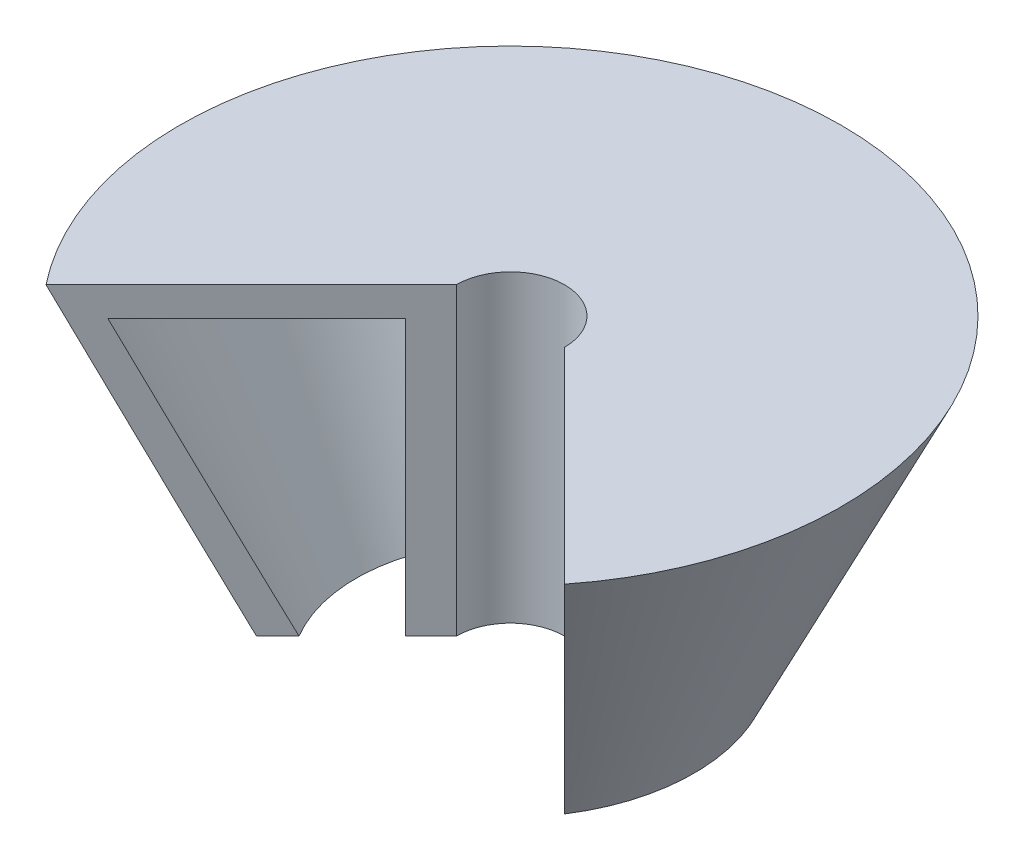
ISO-10303-21;
HEADER;
FILE_DESCRIPTION(('STEP AP214'),'2;1');
FILE_NAME('part.step','',(''),(''),'','','');
FILE_SCHEMA(('AUTOMOTIVE_DESIGN { 1 0 10303 214 1 1 1 1 }'));
ENDSEC;
DATA;
#1=APPLICATION_CONTEXT('core data for automotive mechanical design processes');
#2=APPLICATION_PROTOCOL_DEFINITION('international standard','automotive_design',2000,#1);
#3=PRODUCT_CONTEXT('',#1,'mechanical');
#4=PRODUCT('Part','Part','',(#3));
#5=PRODUCT_RELATED_PRODUCT_CATEGORY('part','',(#4));
#6=PRODUCT_DEFINITION_FORMATION('','',#4);
#7=PRODUCT_DEFINITION_CONTEXT('part definition',#1,'design');
#8=PRODUCT_DEFINITION('design','',#6,#7);
#9=PRODUCT_DEFINITION_SHAPE('','',#8);
#10=(LENGTH_UNIT() NAMED_UNIT(*) SI_UNIT(.MILLI.,.METRE.));
#11=(NAMED_UNIT(*) PLANE_ANGLE_UNIT() SI_UNIT($,.RADIAN.));
#12=(NAMED_UNIT(*) SI_UNIT($,.STERADIAN.) SOLID_ANGLE_UNIT());
#13=UNCERTAINTY_MEASURE_WITH_UNIT(LENGTH_MEASURE(1.E-05),#10,'distance_accuracy_value','');
#14=(GEOMETRIC_REPRESENTATION_CONTEXT(3) GLOBAL_UNCERTAINTY_ASSIGNED_CONTEXT((#13)) GLOBAL_UNIT_ASSIGNED_CONTEXT((#10,
#11,#12)) REPRESENTATION_CONTEXT('',''));
#15=CARTESIAN_POINT('',(0.,0.,0.));
#16=DIRECTION('',(0.,0.,1.));
#17=DIRECTION('',(1.,0.,0.));
#18=AXIS2_PLACEMENT_3D('',#15,#16,#17);
#19=CARTESIAN_POINT('',(-80.8563680680222,-5.85374800637956,0.));
#20=DIRECTION('',(0.,-1.,0.));
#21=DIRECTION('',(0.,0.,-1.));
#22=AXIS2_PLACEMENT_3D('',#19,#20,#21);
#23=PLANE('',#22);
#24=DIRECTION('',(0.707106781186556,0.,0.707106781186539));
#25=VECTOR('',#24,1.);
#26=CARTESIAN_POINT('',(-78.5063680680223,-5.85374800637956,-2.35));
#27=LINE('',#26,#25);
#28=CARTESIAN_POINT('',(-76.1563680680222,-5.85374800637956,0.));
#29=VERTEX_POINT('',#28);
#30=CARTESIAN_POINT('',(-75.2909421410428,-5.85374800637956,0.865425926979373));
#31=VERTEX_POINT('',#30);
#32=EDGE_CURVE('E115',#29,#31,#27,.T.);
#33=ORIENTED_EDGE('',*,*,#32,.F.);
#34=CARTESIAN_POINT('',(-78.0063680680222,-5.85374800637956,0.));
#35=DIRECTION('',(0.,1.,0.));
#36=DIRECTION('',(0.,0.,1.));
#37=AXIS2_PLACEMENT_3D('',#34,#35,#36);
#38=CIRCLE('',#37,1.85);
#39=CARTESIAN_POINT('',(-79.8563680680222,-5.85374800637956,0.));
#40=VERTEX_POINT('',#39);
#41=EDGE_CURVE('E111',#29,#40,#38,.T.);
#42=ORIENTED_EDGE('',*,*,#41,.T.);
#43=DIRECTION('',(0.707106781186541,0.,-0.707106781186554));
#44=VECTOR('',#43,1.);
#45=CARTESIAN_POINT('',(-80.3563680680222,-5.85374800637956,0.5));
#46=LINE('',#45,#44);
#47=CARTESIAN_POINT('',(-80.7217939950016,-5.85374800637956,0.865425926979399));
#48=VERTEX_POINT('',#47);
#49=EDGE_CURVE('E47',#48,#40,#46,.T.);
#50=ORIENTED_EDGE('',*,*,#49,.F.);
#51=CARTESIAN_POINT('',(-78.0063680680222,-5.85374800637956,0.));
#52=DIRECTION('',(0.,1.,0.));
#53=DIRECTION('',(0.,0.,1.));
#54=AXIS2_PLACEMENT_3D('',#51,#52,#53);
#55=CIRCLE('',#54,2.85000000000001);
#56=EDGE_CURVE('E101',#31,#48,#55,.T.);
#57=ORIENTED_EDGE('',*,*,#56,.F.);
#58=EDGE_LOOP('',(#33,#42,#50,#57));
#59=FACE_BOUND('',#58,.T.);
#60=ADVANCED_FACE('F33',(#59),#23,.T.);
#61=CARTESIAN_POINT('',(-78.0063680680222,33.572966507177,0.));
#62=DIRECTION('',(0.,1.,0.));
#63=DIRECTION('',(0.,0.,1.));
#64=AXIS2_PLACEMENT_3D('',#61,#62,#63);
#65=CYLINDRICAL_SURFACE('',#64,2.85000000000001);
#66=DIRECTION('',(0.,1.,0.));
#67=VECTOR('',#66,1.);
#68=CARTESIAN_POINT('',(-75.2909421410428,33.572966507177,0.865425926979373));
#69=LINE('',#68,#67);
#70=CARTESIAN_POINT('',(-75.2909421410428,3.54625199362044,0.865425926979374));
#71=VERTEX_POINT('',#70);
#72=EDGE_CURVE('E138',#31,#71,#69,.T.);
#73=ORIENTED_EDGE('',*,*,#72,.F.);
#74=ORIENTED_EDGE('',*,*,#56,.T.);
#75=DIRECTION('',(0.,1.,0.));
#76=VECTOR('',#75,1.);
#77=CARTESIAN_POINT('',(-80.7217939950016,33.572966507177,0.865425926979399));
#78=LINE('',#77,#76);
#79=CARTESIAN_POINT('',(-80.7217939950016,3.54625199362044,0.865425926979404));
#80=VERTEX_POINT('',#79);
#81=EDGE_CURVE('E137',#80,#48,#78,.F.);
#82=ORIENTED_EDGE('',*,*,#81,.F.);
#83=CARTESIAN_POINT('',(-78.0063680680222,3.54625199362044,0.));
#84=DIRECTION('',(0.,1.,0.));
#85=DIRECTION('',(0.,0.,1.));
#86=AXIS2_PLACEMENT_3D('',#83,#84,#85);
#87=CIRCLE('',#86,2.85000000000001);
#88=EDGE_CURVE('E127',#71,#80,#87,.T.);
#89=ORIENTED_EDGE('',*,*,#88,.F.);
#90=EDGE_LOOP('',(#73,#74,#82,#89));
#91=FACE_BOUND('',#90,.T.);
#92=ADVANCED_FACE('F135',(#91),#65,.T.);
#93=CARTESIAN_POINT('',(-80.8563680680222,3.54625199362044,0.));
#94=DIRECTION('',(0.,-1.,0.));
#95=DIRECTION('',(0.,0.,-1.));
#96=AXIS2_PLACEMENT_3D('',#93,#94,#95);
#97=PLANE('',#96);
#98=DIRECTION('',(0.707106781186556,0.,0.707106781186539));
#99=VECTOR('',#98,1.);
#100=CARTESIAN_POINT('',(-78.5063680680223,3.54625199362044,-2.35));
#101=LINE('',#100,#99);
#102=CARTESIAN_POINT('',(-70.2023199507315,3.54625199362044,5.95404811729057));
#103=VERTEX_POINT('',#102);
#104=EDGE_CURVE('E172',#71,#103,#101,.T.);
#105=ORIENTED_EDGE('',*,*,#104,.F.);
#106=ORIENTED_EDGE('',*,*,#88,.T.);
#107=DIRECTION('',(0.707106781186541,0.,-0.707106781186554));
#108=VECTOR('',#107,1.);
#109=CARTESIAN_POINT('',(-80.3563680680222,3.54625199362044,0.5));
#110=LINE('',#109,#108);
#111=CARTESIAN_POINT('',(-85.8104161853128,3.54625199362044,5.95404811729071));
#112=VERTEX_POINT('',#111);
#113=EDGE_CURVE('E145',#112,#80,#110,.T.);
#114=ORIENTED_EDGE('',*,*,#113,.F.);
#115=CARTESIAN_POINT('',(-78.0063680680222,3.54625199362044,0.));
#116=DIRECTION('',(0.,1.,0.));
#117=DIRECTION('',(0.,0.,1.));
#118=AXIS2_PLACEMENT_3D('',#115,#116,#117);
#119=CIRCLE('',#118,9.81600000000001);
#120=EDGE_CURVE('E124',#103,#112,#119,.T.);
#121=ORIENTED_EDGE('',*,*,#120,.F.);
#122=EDGE_LOOP('',(#105,#106,#114,#121));
#123=FACE_BOUND('',#122,.T.);
#124=ADVANCED_FACE('F179',(#123),#97,.T.);
#125=CARTESIAN_POINT('',(-78.0063680680222,-5.85374800637956,0.));
#126=DIRECTION('',(0.,1.,0.));
#127=DIRECTION('',(0.,0.,1.));
#128=AXIS2_PLACEMENT_3D('',#125,#126,#127);
#129=CONICAL_SURFACE('',#128,5.27417307692309,0.450095679732815);
#130=CARTESIAN_POINT('',(-70.2022510047608,3.54645199362044,5.95411706326129));
#131=CARTESIAN_POINT('',(-70.4727416047507,2.76190411823602,5.68362646327139));
#132=CARTESIAN_POINT('',(-70.7434112220224,1.97747886995518,5.41295684599975));
#133=CARTESIAN_POINT('',(-71.285427401019,0.409100497421345,4.87094066700316));
#134=CARTESIAN_POINT('',(-71.5567739598691,-0.374852628819156,4.59959410815304));
#135=CARTESIAN_POINT('',(-71.9645429293532,-1.55026457639364,4.19182513866892));
#136=CARTESIAN_POINT('',(-72.1005910375323,-1.94198302371806,4.05577703048989));
#137=CARTESIAN_POINT('',(-72.3730123521215,-2.72519356659297,3.78335571590064));
#138=CARTESIAN_POINT('',(-72.509385558382,-3.11668566224762,3.64698250964016));
#139=CARTESIAN_POINT('',(-72.7825485318272,-3.89938136411605,3.37381953619501));
#140=CARTESIAN_POINT('',(-72.9193383007927,-4.29058496908759,3.23702976722948));
#141=CARTESIAN_POINT('',(-73.1934878286845,-5.07259321900733,2.96288023933772));
#142=CARTESIAN_POINT('',(-73.33084758852,-5.46339786331784,2.8255204795022));
#143=CARTESIAN_POINT('',(-73.4685691309579,-5.85394800637961,2.68779893706426));
#144=B_SPLINE_CURVE_WITH_KNOTS('',3,(#130,#131,#132,#133,#134,#135,#136,#137,#138,#139,#140,
#141,#142,#143),.UNSPECIFIED.,.F.,.F.,(4,2,2,2,2,2,4),(0.,2.61851432373632,5.23701754607913,
6.54627420818368,7.85553026738953,9.16479193175479,10.4740556855667),.UNSPECIFIED.);
#145=CARTESIAN_POINT('',(-73.4684985958893,-5.85374800637956,2.6878694721329));
#146=VERTEX_POINT('',#145);
#147=EDGE_CURVE('E166',#103,#146,#144,.T.);
#148=ORIENTED_EDGE('',*,*,#147,.F.);
#149=ORIENTED_EDGE('',*,*,#120,.T.);
#150=CARTESIAN_POINT('',(-82.5441670050865,-5.85394800637956,2.68779893706427));
#151=CARTESIAN_POINT('',(-82.6408227770713,-5.57987266202558,2.78445470904904));
#152=CARTESIAN_POINT('',(-82.7372940003969,-5.30566736950892,2.88092593237468));
#153=CARTESIAN_POINT('',(-82.9299303422724,-4.7570420758768,3.07356227425025));
#154=CARTESIAN_POINT('',(-83.0260954610757,-4.48262207493929,3.16972739305354));
#155=CARTESIAN_POINT('',(-83.3142259212576,-3.6591084464173,3.45785785323539));
#156=CARTESIAN_POINT('',(-83.5058268364218,-3.10975985818158,3.64945876839962));
#157=CARTESIAN_POINT('',(-83.8883652594097,-2.01060454017016,4.03199719138748));
#158=CARTESIAN_POINT('',(-84.0793027704144,-1.460797812607,4.22293470239219));
#159=CARTESIAN_POINT('',(-84.460702729594,-0.360854555747703,4.60433466157186));
#160=CARTESIAN_POINT('',(-84.6511651774762,0.189281973751481,4.79479710945398));
#161=CARTESIAN_POINT('',(-85.0031777645143,1.20720588711498,5.14680969649219));
#162=CARTESIAN_POINT('',(-85.1647766198996,1.67495958784793,5.30840855187743));
#163=CARTESIAN_POINT('',(-85.4877709997554,2.61060852767654,5.63140293173324));
#164=CARTESIAN_POINT('',(-85.6491665238231,3.07850376705038,5.79279845580092));
#165=CARTESIAN_POINT('',(-85.8104851312836,3.54645199362043,5.95411706326143));
#166=B_SPLINE_CURVE_WITH_KNOTS('',3,(#150,#151,#152,#153,#154,#155,#156,#157,#158,#159,#160,
#161,#162,#163,#164,#165),.UNSPECIFIED.,.F.,.F.,(4,2,2,2,2,2,2,4),(0.,0.918812794800676,
1.83762482885608,3.67524442316324,5.51285519376712,7.35046709691022,8.91225992542895,
10.4740558437005),.UNSPECIFIED.);
#167=CARTESIAN_POINT('',(-82.5442375401552,-5.85374800637956,2.68786947213297));
#168=VERTEX_POINT('',#167);
#169=EDGE_CURVE('E183',#168,#112,#166,.T.);
#170=ORIENTED_EDGE('',*,*,#169,.F.);
#171=CARTESIAN_POINT('',(-78.0063680680222,-5.85374800637956,0.));
#172=DIRECTION('',(0.,1.,0.));
#173=DIRECTION('',(0.,0.,1.));
#174=AXIS2_PLACEMENT_3D('',#171,#172,#173);
#175=CIRCLE('',#174,5.27417307692309);
#176=EDGE_CURVE('E121',#146,#168,#175,.T.);
#177=ORIENTED_EDGE('',*,*,#176,.F.);
#178=EDGE_LOOP('',(#148,#149,#170,#177));
#179=FACE_BOUND('',#178,.T.);
#180=ADVANCED_FACE('F174',(#179),#129,.F.);
#181=CARTESIAN_POINT('',(-83.2805411449453,-5.85374800637956,0.));
#182=DIRECTION('',(0.,-1.,0.));
#183=DIRECTION('',(0.,0.,-1.));
#184=AXIS2_PLACEMENT_3D('',#181,#182,#183);
#185=PLANE('',#184);
#186=DIRECTION('',(0.707106781186556,0.,0.707106781186539));
#187=VECTOR('',#186,1.);
#188=CARTESIAN_POINT('',(-79.7184546064839,-5.85374800637956,-3.56208653846154));
#189=LINE('',#188,#187);
#190=CARTESIAN_POINT('',(-72.7417612309919,-5.85374800637956,3.41460683703024));
#191=VERTEX_POINT('',#190);
#192=EDGE_CURVE('E143',#146,#191,#189,.T.);
#193=ORIENTED_EDGE('',*,*,#192,.F.);
#194=ORIENTED_EDGE('',*,*,#176,.T.);
#195=DIRECTION('',(0.707106781186541,0.,-0.707106781186554));
#196=VECTOR('',#195,1.);
#197=CARTESIAN_POINT('',(-81.5684546064838,-5.85374800637956,1.71208653846154));
#198=LINE('',#197,#196);
#199=CARTESIAN_POINT('',(-83.2709749050525,-5.85374800637956,3.41460683703032));
#200=VERTEX_POINT('',#199);
#201=EDGE_CURVE('E188',#200,#168,#198,.T.);
#202=ORIENTED_EDGE('',*,*,#201,.F.);
#203=CARTESIAN_POINT('',(-78.0063680680222,-5.85374800637956,0.));
#204=DIRECTION('',(0.,1.,0.));
#205=DIRECTION('',(0.,0.,1.));
#206=AXIS2_PLACEMENT_3D('',#203,#204,#205);
#207=CIRCLE('',#206,6.275);
#208=EDGE_CURVE('E113',#191,#200,#207,.T.);
#209=ORIENTED_EDGE('',*,*,#208,.F.);
#210=EDGE_LOOP('',(#193,#194,#202,#209));
#211=FACE_BOUND('',#210,.T.);
#212=ADVANCED_FACE('F178',(#211),#185,.T.);
#213=CARTESIAN_POINT('',(-78.0063680680222,4.54625199362044,0.));
#214=DIRECTION('',(0.,1.,0.));
#215=DIRECTION('',(0.,0.,1.));
#216=AXIS2_PLACEMENT_3D('',#213,#214,#215);
#217=CONICAL_SURFACE('',#216,11.3,0.450095679732816);
#218=CARTESIAN_POINT('',(-72.7418310970474,-5.85394800637956,3.4145369709748));
#219=CARTESIAN_POINT('',(-72.6277095007168,-5.52725237475486,3.52865856730536));
#220=CARTESIAN_POINT('',(-72.513739903871,-5.20045067298955,3.64262816415115));
#221=CARTESIAN_POINT('',(-72.2860532216775,-4.54667153277073,3.87031484634464));
#222=CARTESIAN_POINT('',(-72.1723361362301,-4.21969409438664,3.984031931792));
#223=CARTESIAN_POINT('',(-71.831486543411,-3.23855314825396,4.32488152461118));
#224=CARTESIAN_POINT('',(-71.604655436122,-2.58418025452621,4.55171263190018));
#225=CARTESIAN_POINT('',(-71.1515434138187,-1.27505566947035,5.00482465420341));
#226=CARTESIAN_POINT('',(-70.9252624975414,-0.620303979016143,5.23110557048073));
#227=CARTESIAN_POINT('',(-70.4730955463142,0.689472231437443,5.68327252170786));
#228=CARTESIAN_POINT('',(-70.247209511473,1.3444967515118,5.90915855654906));
#229=CARTESIAN_POINT('',(-69.8752338483333,2.42401772310672,6.28113421968882));
#230=CARTESIAN_POINT('',(-69.7290592708166,2.84845564603117,6.42730879720551));
#231=CARTESIAN_POINT('',(-69.4368138763792,3.69740331372606,6.7195541916429));
#232=CARTESIAN_POINT('',(-69.290743059534,4.12191305854853,6.86562500848806));
#233=CARTESIAN_POINT('',(-69.1447146816242,4.54645199362044,7.01165338639792));
#234=B_SPLINE_CURVE_WITH_KNOTS('',3,(#218,#219,#220,#221,#222,#223,#224,#225,#226,#227,#228,
#229,#230,#231,#232,#233),.UNSPECIFIED.,.F.,.F.,(4,2,2,2,2,2,2,4),(0.,1.09315922410895,
2.18631801668641,4.37263307609395,6.55894311156472,8.74525374827297,10.1615637476575,
11.5778747772657),.UNSPECIFIED.);
#235=CARTESIAN_POINT('',(-69.1447834751384,4.54625199362044,7.01158459288368));
#236=VERTEX_POINT('',#235);
#237=EDGE_CURVE('E141',#191,#236,#234,.T.);
#238=ORIENTED_EDGE('',*,*,#237,.F.);
#239=ORIENTED_EDGE('',*,*,#208,.T.);
#240=CARTESIAN_POINT('',(-86.8680214544202,4.54645199362044,7.01165338639808));
#241=CARTESIAN_POINT('',(-86.5695719775031,3.67884663330206,6.71320390948102));
#242=CARTESIAN_POINT('',(-86.2709726971673,2.81134406270101,6.41460462914517));
#243=CARTESIAN_POINT('',(-85.6732443306744,1.07670623487458,5.81687626265219));
#244=CARTESIAN_POINT('',(-85.3741152455698,0.209570976923692,5.51774717754763));
#245=CARTESIAN_POINT('',(-84.775095428125,-1.52417526701754,4.91872736010285));
#246=CARTESIAN_POINT('',(-84.4752046946164,-2.39078625220111,4.61883662659426));
#247=CARTESIAN_POINT('',(-84.0244450874812,-3.69006318258229,4.16807701945905));
#248=CARTESIAN_POINT('',(-83.8740378182217,-4.12304932898136,4.01766975019954));
#249=CARTESIAN_POINT('',(-83.5728088618376,-4.98873353408877,3.7164407938154));
#250=CARTESIAN_POINT('',(-83.4219871744344,-5.42143159260318,3.56561910641217));
#251=CARTESIAN_POINT('',(-83.2709050389971,-5.85394800637957,3.41453697097489));
#252=B_SPLINE_CURVE_WITH_KNOTS('',3,(#240,#241,#242,#243,#244,#245,#246,#247,#248,#249,#250,
#251),.UNSPECIFIED.,.F.,.F.,(4,2,2,2,2,4),(0.,2.89446903914452,5.788932334279,8.68340007224553,
10.1306368011721,11.5778745033248),.UNSPECIFIED.);
#253=CARTESIAN_POINT('',(-86.867952660906,4.54625199362044,7.01158459288385));
#254=VERTEX_POINT('',#253);
#255=EDGE_CURVE('E203',#254,#200,#252,.T.);
#256=ORIENTED_EDGE('',*,*,#255,.F.);
#257=CARTESIAN_POINT('',(-78.0063680680222,4.54625199362044,0.));
#258=DIRECTION('',(0.,1.,0.));
#259=DIRECTION('',(0.,0.,1.));
#260=AXIS2_PLACEMENT_3D('',#257,#258,#259);
#261=CIRCLE('',#260,11.3);
#262=EDGE_CURVE('E108',#236,#254,#261,.T.);
#263=ORIENTED_EDGE('',*,*,#262,.F.);
#264=EDGE_LOOP('',(#238,#239,#256,#263));
#265=FACE_BOUND('',#264,.T.);
#266=ADVANCED_FACE('F155',(#265),#217,.T.);
#267=CARTESIAN_POINT('',(-89.3063680680223,4.54625199362044,0.));
#268=DIRECTION('',(0.,1.,0.));
#269=DIRECTION('',(0.,0.,1.));
#270=AXIS2_PLACEMENT_3D('',#267,#268,#269);
#271=PLANE('',#270);
#272=DIRECTION('',(-0.707106781186556,0.,-0.707106781186539));
#273=VECTOR('',#272,1.);
#274=CARTESIAN_POINT('',(-76.1563680680222,4.54625199362044,0.));
#275=LINE('',#274,#273);
#276=CARTESIAN_POINT('',(-76.1563680680222,4.54625199362044,0.));
#277=VERTEX_POINT('',#276);
#278=EDGE_CURVE('E54',#236,#277,#275,.T.);
#279=ORIENTED_EDGE('',*,*,#278,.F.);
#280=ORIENTED_EDGE('',*,*,#262,.T.);
#281=DIRECTION('',(-0.707106781186541,0.,0.707106781186554));
#282=VECTOR('',#281,1.);
#283=CARTESIAN_POINT('',(-79.8563680680222,4.54625199362044,0.));
#284=LINE('',#283,#282);
#285=CARTESIAN_POINT('',(-79.8563680680222,4.54625199362044,0.));
#286=VERTEX_POINT('',#285);
#287=EDGE_CURVE('E95',#286,#254,#284,.T.);
#288=ORIENTED_EDGE('',*,*,#287,.F.);
#289=CARTESIAN_POINT('',(-78.0063680680222,4.54625199362044,0.));
#290=DIRECTION('',(0.,1.,0.));
#291=DIRECTION('',(0.,0.,1.));
#292=AXIS2_PLACEMENT_3D('',#289,#290,#291);
#293=CIRCLE('',#292,1.85);
#294=EDGE_CURVE('E106',#277,#286,#293,.T.);
#295=ORIENTED_EDGE('',*,*,#294,.F.);
#296=EDGE_LOOP('',(#279,#280,#288,#295));
#297=FACE_BOUND('',#296,.T.);
#298=ADVANCED_FACE('F105',(#297),#271,.T.);
#299=CARTESIAN_POINT('',(-78.0063680680222,33.572966507177,0.));
#300=DIRECTION('',(0.,1.,0.));
#301=DIRECTION('',(0.,0.,1.));
#302=AXIS2_PLACEMENT_3D('',#299,#300,#301);
#303=CYLINDRICAL_SURFACE('',#302,1.85);
#304=DIRECTION('',(0.,1.,0.));
#305=VECTOR('',#304,1.);
#306=CARTESIAN_POINT('',(-76.1563680680222,33.572966507177,0.));
#307=LINE('',#306,#305);
#308=EDGE_CURVE('E11',#277,#29,#307,.F.);
#309=ORIENTED_EDGE('',*,*,#308,.F.);
#310=ORIENTED_EDGE('',*,*,#294,.T.);
#311=DIRECTION('',(0.,1.,0.));
#312=VECTOR('',#311,1.);
#313=CARTESIAN_POINT('',(-79.8563680680222,33.572966507177,0.));
#314=LINE('',#313,#312);
#315=EDGE_CURVE('E40',#40,#286,#314,.T.);
#316=ORIENTED_EDGE('',*,*,#315,.F.);
#317=ORIENTED_EDGE('',*,*,#41,.F.);
#318=EDGE_LOOP('',(#309,#310,#316,#317));
#319=FACE_BOUND('',#318,.T.);
#320=ADVANCED_FACE('F110',(#319),#303,.F.);
#321=CARTESIAN_POINT('',(-79.8563680680222,-6.45374800637956,0.));
#322=DIRECTION('',(-0.707106781186554,0.,-0.707106781186541));
#323=DIRECTION('',(-0.707106781186541,0.,0.707106781186554));
#324=AXIS2_PLACEMENT_3D('',#321,#322,#323);
#325=PLANE('',#324);
#326=ORIENTED_EDGE('',*,*,#49,.T.);
#327=ORIENTED_EDGE('',*,*,#315,.T.);
#328=ORIENTED_EDGE('',*,*,#287,.T.);
#329=ORIENTED_EDGE('',*,*,#255,.T.);
#330=ORIENTED_EDGE('',*,*,#201,.T.);
#331=ORIENTED_EDGE('',*,*,#169,.T.);
#332=ORIENTED_EDGE('',*,*,#113,.T.);
#333=ORIENTED_EDGE('',*,*,#81,.T.);
#334=EDGE_LOOP('',(#326,#327,#328,#329,#330,#331,#332,#333));
#335=FACE_BOUND('',#334,.T.);
#336=ADVANCED_FACE('F94',(#335),#325,.F.);
#337=CARTESIAN_POINT('',(-76.1563680680222,-6.45374800637956,0.));
#338=DIRECTION('',(0.707106781186539,0.,-0.707106781186556));
#339=DIRECTION('',(-0.707106781186556,0.,-0.707106781186539));
#340=AXIS2_PLACEMENT_3D('',#337,#338,#339);
#341=PLANE('',#340);
#342=ORIENTED_EDGE('',*,*,#32,.T.);
#343=ORIENTED_EDGE('',*,*,#72,.T.);
#344=ORIENTED_EDGE('',*,*,#104,.T.);
#345=ORIENTED_EDGE('',*,*,#147,.T.);
#346=ORIENTED_EDGE('',*,*,#192,.T.);
#347=ORIENTED_EDGE('',*,*,#237,.T.);
#348=ORIENTED_EDGE('',*,*,#278,.T.);
#349=ORIENTED_EDGE('',*,*,#308,.T.);
#350=EDGE_LOOP('',(#342,#343,#344,#345,#346,#347,#348,#349));
#351=FACE_BOUND('',#350,.T.);
#352=ADVANCED_FACE('F159',(#351),#341,.F.);
#353=CLOSED_SHELL('',(#60,#92,#124,#180,#212,#266,#298,#320,#336,#352));
#354=MANIFOLD_SOLID_BREP('B2',#353);
#355=ADVANCED_BREP_SHAPE_REPRESENTATION('',(#18,#354),#14);
#356=SHAPE_DEFINITION_REPRESENTATION(#9,#355);
ENDSEC;
END-ISO-10303-21;
